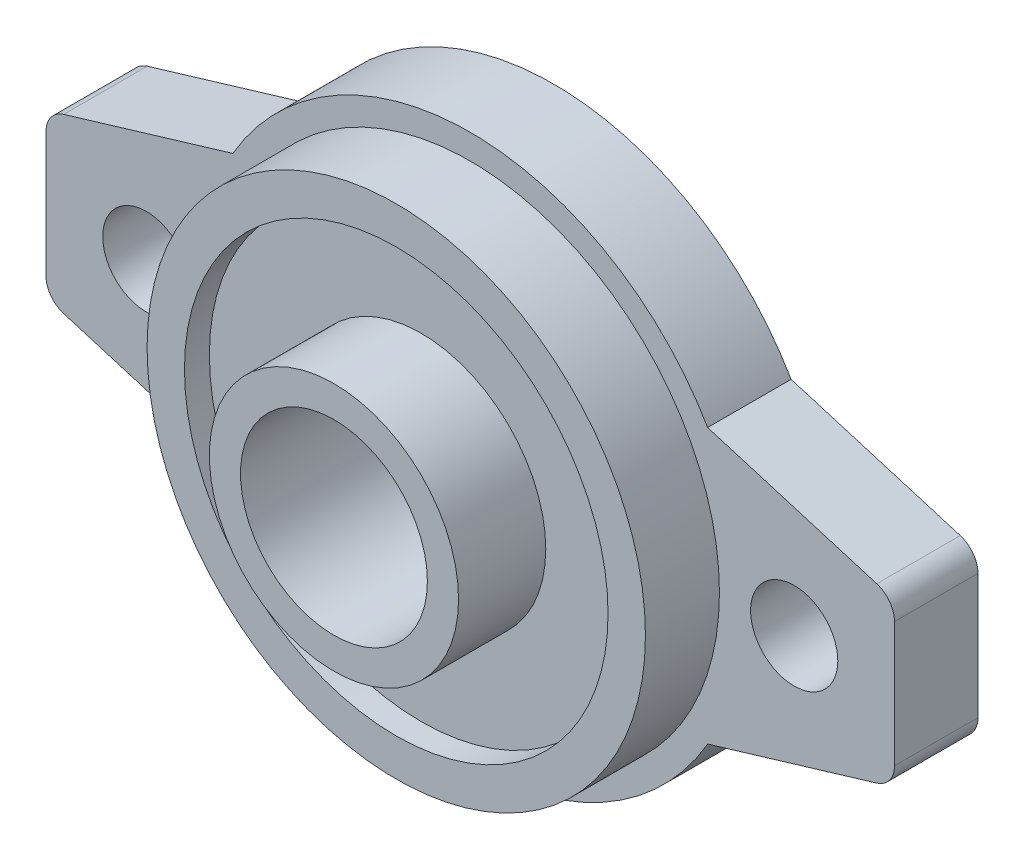
ISO-10303-21;
HEADER;
FILE_DESCRIPTION(('STEP AP214'),'2;1');
FILE_NAME('part.step','',(''),(''),'','','');
FILE_SCHEMA(('AUTOMOTIVE_DESIGN { 1 0 10303 214 1 1 1 1 }'));
ENDSEC;
DATA;
#1=APPLICATION_CONTEXT('core data for automotive mechanical design processes');
#2=APPLICATION_PROTOCOL_DEFINITION('international standard','automotive_design',2000,#1);
#3=PRODUCT_CONTEXT('',#1,'mechanical');
#4=PRODUCT('Part','Part','',(#3));
#5=PRODUCT_RELATED_PRODUCT_CATEGORY('part','',(#4));
#6=PRODUCT_DEFINITION_FORMATION('','',#4);
#7=PRODUCT_DEFINITION_CONTEXT('part definition',#1,'design');
#8=PRODUCT_DEFINITION('design','',#6,#7);
#9=PRODUCT_DEFINITION_SHAPE('','',#8);
#10=(LENGTH_UNIT() NAMED_UNIT(*) SI_UNIT(.MILLI.,.METRE.));
#11=(NAMED_UNIT(*) PLANE_ANGLE_UNIT() SI_UNIT($,.RADIAN.));
#12=(NAMED_UNIT(*) SI_UNIT($,.STERADIAN.) SOLID_ANGLE_UNIT());
#13=UNCERTAINTY_MEASURE_WITH_UNIT(LENGTH_MEASURE(1.E-05),#10,'distance_accuracy_value','');
#14=(GEOMETRIC_REPRESENTATION_CONTEXT(3) GLOBAL_UNCERTAINTY_ASSIGNED_CONTEXT((#13)) GLOBAL_UNIT_ASSIGNED_CONTEXT((#10,
#11,#12)) REPRESENTATION_CONTEXT('',''));
#15=CARTESIAN_POINT('',(0.,0.,0.));
#16=DIRECTION('',(0.,0.,1.));
#17=DIRECTION('',(1.,0.,0.));
#18=AXIS2_PLACEMENT_3D('',#15,#16,#17);
#19=CARTESIAN_POINT('',(0.,0.,6.7));
#20=DIRECTION('',(0.,0.,-1.));
#21=DIRECTION('',(-1.,0.,0.));
#22=AXIS2_PLACEMENT_3D('',#19,#20,#21);
#23=CYLINDRICAL_SURFACE('',#22,22.);
#24=CARTESIAN_POINT('',(0.,0.,0.));
#25=DIRECTION('',(0.,0.,1.));
#26=DIRECTION('',(1.,0.,0.));
#27=AXIS2_PLACEMENT_3D('',#24,#25,#26);
#28=CIRCLE('',#27,22.);
#29=CARTESIAN_POINT('',(-19.0525588832576,-11.,0.));
#30=VERTEX_POINT('',#29);
#31=CARTESIAN_POINT('',(19.0525588832577,-11.,0.));
#32=VERTEX_POINT('',#31);
#33=EDGE_CURVE('E313',#30,#32,#28,.T.);
#34=ORIENTED_EDGE('',*,*,#33,.T.);
#35=DIRECTION('',(0.,0.,-1.));
#36=VECTOR('',#35,1.);
#37=CARTESIAN_POINT('',(19.0525588832577,-11.,6.7));
#38=LINE('',#37,#36);
#39=CARTESIAN_POINT('',(19.0525588832577,-11.,6.7));
#40=VERTEX_POINT('',#39);
#41=EDGE_CURVE('E217',#40,#32,#38,.T.);
#42=ORIENTED_EDGE('',*,*,#41,.F.);
#43=CARTESIAN_POINT('',(0.,0.,6.7));
#44=DIRECTION('',(0.,0.,1.));
#45=DIRECTION('',(1.,0.,0.));
#46=AXIS2_PLACEMENT_3D('',#43,#44,#45);
#47=CIRCLE('',#46,22.);
#48=CARTESIAN_POINT('',(-19.0525588832576,-11.,6.7));
#49=VERTEX_POINT('',#48);
#50=EDGE_CURVE('E201',#49,#40,#47,.T.);
#51=ORIENTED_EDGE('',*,*,#50,.F.);
#52=DIRECTION('',(0.,0.,-1.));
#53=VECTOR('',#52,1.);
#54=CARTESIAN_POINT('',(-19.0525588832576,-11.,6.7));
#55=LINE('',#54,#53);
#56=EDGE_CURVE('E215',#49,#30,#55,.T.);
#57=ORIENTED_EDGE('',*,*,#56,.T.);
#58=EDGE_LOOP('',(#34,#42,#51,#57));
#59=FACE_BOUND('',#58,.T.);
#60=ADVANCED_FACE('F103',(#59),#23,.T.);
#61=CARTESIAN_POINT('',(4.60066999953504,-15.3355666651168,6.7));
#62=DIRECTION('',(0.287347885566346,-0.957826285221151,0.));
#63=DIRECTION('',(0.957826285221151,0.287347885566346,0.));
#64=AXIS2_PLACEMENT_3D('',#61,#62,#63);
#65=PLANE('',#64);
#66=DIRECTION('',(-0.957826285221151,-0.287347885566345,0.));
#67=VECTOR('',#66,1.);
#68=CARTESIAN_POINT('',(4.60066999953504,-15.3355666651168,0.));
#69=LINE('',#68,#67);
#70=CARTESIAN_POINT('',(32.6272546543903,-6.9275912686602,0.));
#71=VERTEX_POINT('',#70);
#72=EDGE_CURVE('E287',#71,#32,#69,.T.);
#73=ORIENTED_EDGE('',*,*,#72,.F.);
#74=DIRECTION('',(0.,0.,-1.));
#75=VECTOR('',#74,1.);
#76=CARTESIAN_POINT('',(32.6272546543903,-6.9275912686602,6.7));
#77=LINE('',#76,#75);
#78=CARTESIAN_POINT('',(32.6272546543903,-6.9275912686602,6.7));
#79=VERTEX_POINT('',#78);
#80=EDGE_CURVE('E112',#71,#79,#77,.F.);
#81=ORIENTED_EDGE('',*,*,#80,.T.);
#82=DIRECTION('',(-0.957826285221151,-0.287347885566345,0.));
#83=VECTOR('',#82,1.);
#84=CARTESIAN_POINT('',(4.60066999953504,-15.3355666651168,6.7));
#85=LINE('',#84,#83);
#86=EDGE_CURVE('E219',#79,#40,#85,.T.);
#87=ORIENTED_EDGE('',*,*,#86,.T.);
#88=ORIENTED_EDGE('',*,*,#41,.T.);
#89=EDGE_LOOP('',(#73,#81,#87,#88));
#90=FACE_BOUND('',#89,.T.);
#91=ADVANCED_FACE('F286',(#90),#65,.T.);
#92=CARTESIAN_POINT('',(34.0525588832577,0.,6.7));
#93=DIRECTION('',(1.,0.,0.));
#94=DIRECTION('',(0.,0.,-1.));
#95=AXIS2_PLACEMENT_3D('',#92,#93,#94);
#96=PLANE('',#95);
#97=DIRECTION('',(0.,-1.,0.));
#98=VECTOR('',#97,1.);
#99=CARTESIAN_POINT('',(34.0525588832577,0.,6.7));
#100=LINE('',#99,#98);
#101=CARTESIAN_POINT('',(34.0525588832577,5.01193869821789,6.7));
#102=VERTEX_POINT('',#101);
#103=CARTESIAN_POINT('',(34.0525588832577,-5.01193869821789,6.7));
#104=VERTEX_POINT('',#103);
#105=EDGE_CURVE('E292',#102,#104,#100,.T.);
#106=ORIENTED_EDGE('',*,*,#105,.T.);
#107=DIRECTION('',(0.,0.,-1.));
#108=VECTOR('',#107,1.);
#109=CARTESIAN_POINT('',(34.0525588832577,-5.01193869821789,6.7));
#110=LINE('',#109,#108);
#111=CARTESIAN_POINT('',(34.0525588832577,-5.01193869821789,0.));
#112=VERTEX_POINT('',#111);
#113=EDGE_CURVE('E279',#104,#112,#110,.T.);
#114=ORIENTED_EDGE('',*,*,#113,.T.);
#115=DIRECTION('',(0.,-1.,0.));
#116=VECTOR('',#115,1.);
#117=CARTESIAN_POINT('',(34.0525588832577,0.,0.));
#118=LINE('',#117,#116);
#119=CARTESIAN_POINT('',(34.0525588832577,5.01193869821789,0.));
#120=VERTEX_POINT('',#119);
#121=EDGE_CURVE('E300',#120,#112,#118,.T.);
#122=ORIENTED_EDGE('',*,*,#121,.F.);
#123=DIRECTION('',(0.,0.,-1.));
#124=VECTOR('',#123,1.);
#125=CARTESIAN_POINT('',(34.0525588832577,5.01193869821789,6.7));
#126=LINE('',#125,#124);
#127=EDGE_CURVE('E276',#120,#102,#126,.F.);
#128=ORIENTED_EDGE('',*,*,#127,.T.);
#129=EDGE_LOOP('',(#106,#114,#122,#128));
#130=FACE_BOUND('',#129,.T.);
#131=ADVANCED_FACE('F299',(#130),#96,.T.);
#132=CARTESIAN_POINT('',(4.60066999953503,15.3355666651168,6.7));
#133=DIRECTION('',(0.287347885566345,0.957826285221151,0.));
#134=DIRECTION('',(-0.957826285221151,0.287347885566345,0.));
#135=AXIS2_PLACEMENT_3D('',#132,#133,#134);
#136=PLANE('',#135);
#137=DIRECTION('',(0.957826285221151,-0.287347885566345,0.));
#138=VECTOR('',#137,1.);
#139=CARTESIAN_POINT('',(4.60066999953503,15.3355666651168,6.7));
#140=LINE('',#139,#138);
#141=CARTESIAN_POINT('',(19.0525588832577,11.,6.7));
#142=VERTEX_POINT('',#141);
#143=CARTESIAN_POINT('',(32.6272546543904,6.92759126866019,6.7));
#144=VERTEX_POINT('',#143);
#145=EDGE_CURVE('E343',#142,#144,#140,.T.);
#146=ORIENTED_EDGE('',*,*,#145,.T.);
#147=DIRECTION('',(0.,0.,-1.));
#148=VECTOR('',#147,1.);
#149=CARTESIAN_POINT('',(32.6272546543904,6.92759126866019,6.7));
#150=LINE('',#149,#148);
#151=CARTESIAN_POINT('',(32.6272546543904,6.92759126866019,0.));
#152=VERTEX_POINT('',#151);
#153=EDGE_CURVE('E13',#144,#152,#150,.T.);
#154=ORIENTED_EDGE('',*,*,#153,.T.);
#155=DIRECTION('',(0.957826285221151,-0.287347885566345,0.));
#156=VECTOR('',#155,1.);
#157=CARTESIAN_POINT('',(4.60066999953503,15.3355666651168,0.));
#158=LINE('',#157,#156);
#159=CARTESIAN_POINT('',(19.0525588832577,11.,0.));
#160=VERTEX_POINT('',#159);
#161=EDGE_CURVE('E307',#160,#152,#158,.T.);
#162=ORIENTED_EDGE('',*,*,#161,.F.);
#163=DIRECTION('',(0.,0.,-1.));
#164=VECTOR('',#163,1.);
#165=CARTESIAN_POINT('',(19.0525588832577,11.,6.7));
#166=LINE('',#165,#164);
#167=EDGE_CURVE('E233',#142,#160,#166,.T.);
#168=ORIENTED_EDGE('',*,*,#167,.F.);
#169=EDGE_LOOP('',(#146,#154,#162,#168));
#170=FACE_BOUND('',#169,.T.);
#171=ADVANCED_FACE('F341',(#170),#136,.T.);
#172=CARTESIAN_POINT('',(0.,0.,6.7));
#173=DIRECTION('',(0.,0.,-1.));
#174=DIRECTION('',(-1.,0.,0.));
#175=AXIS2_PLACEMENT_3D('',#172,#173,#174);
#176=CYLINDRICAL_SURFACE('',#175,22.);
#177=CARTESIAN_POINT('',(0.,0.,0.));
#178=DIRECTION('',(0.,0.,1.));
#179=DIRECTION('',(1.,0.,0.));
#180=AXIS2_PLACEMENT_3D('',#177,#178,#179);
#181=CIRCLE('',#180,22.);
#182=CARTESIAN_POINT('',(-19.0525588832577,11.,0.));
#183=VERTEX_POINT('',#182);
#184=EDGE_CURVE('E311',#160,#183,#181,.T.);
#185=ORIENTED_EDGE('',*,*,#184,.T.);
#186=DIRECTION('',(0.,0.,-1.));
#187=VECTOR('',#186,1.);
#188=CARTESIAN_POINT('',(-19.0525588832577,11.,6.7));
#189=LINE('',#188,#187);
#190=CARTESIAN_POINT('',(-19.0525588832577,11.,6.7));
#191=VERTEX_POINT('',#190);
#192=EDGE_CURVE('E327',#191,#183,#189,.T.);
#193=ORIENTED_EDGE('',*,*,#192,.F.);
#194=CARTESIAN_POINT('',(0.,0.,6.7));
#195=DIRECTION('',(0.,0.,1.));
#196=DIRECTION('',(1.,0.,0.));
#197=AXIS2_PLACEMENT_3D('',#194,#195,#196);
#198=CIRCLE('',#197,22.);
#199=EDGE_CURVE('E337',#142,#191,#198,.T.);
#200=ORIENTED_EDGE('',*,*,#199,.F.);
#201=ORIENTED_EDGE('',*,*,#167,.T.);
#202=EDGE_LOOP('',(#185,#193,#200,#201));
#203=FACE_BOUND('',#202,.T.);
#204=ADVANCED_FACE('F335',(#203),#176,.T.);
#205=CARTESIAN_POINT('',(-4.60066999953503,15.3355666651168,6.7));
#206=DIRECTION('',(0.287347885566345,-0.957826285221151,0.));
#207=DIRECTION('',(0.957826285221151,0.287347885566345,0.));
#208=AXIS2_PLACEMENT_3D('',#205,#206,#207);
#209=PLANE('',#208);
#210=DIRECTION('',(-0.957826285221151,-0.287347885566345,0.));
#211=VECTOR('',#210,1.);
#212=CARTESIAN_POINT('',(-4.60066999953503,15.3355666651168,0.));
#213=LINE('',#212,#211);
#214=CARTESIAN_POINT('',(-32.6272546543904,6.92759126866018,0.));
#215=VERTEX_POINT('',#214);
#216=EDGE_CURVE('E319',#183,#215,#213,.T.);
#217=ORIENTED_EDGE('',*,*,#216,.T.);
#218=DIRECTION('',(0.,0.,-1.));
#219=VECTOR('',#218,1.);
#220=CARTESIAN_POINT('',(-32.6272546543904,6.92759126866018,6.7));
#221=LINE('',#220,#219);
#222=CARTESIAN_POINT('',(-32.6272546543904,6.92759126866018,6.7));
#223=VERTEX_POINT('',#222);
#224=EDGE_CURVE('E119',#215,#223,#221,.F.);
#225=ORIENTED_EDGE('',*,*,#224,.T.);
#226=DIRECTION('',(-0.957826285221151,-0.287347885566345,0.));
#227=VECTOR('',#226,1.);
#228=CARTESIAN_POINT('',(-4.60066999953503,15.3355666651168,6.7));
#229=LINE('',#228,#227);
#230=EDGE_CURVE('E352',#191,#223,#229,.T.);
#231=ORIENTED_EDGE('',*,*,#230,.F.);
#232=ORIENTED_EDGE('',*,*,#192,.T.);
#233=EDGE_LOOP('',(#217,#225,#231,#232));
#234=FACE_BOUND('',#233,.T.);
#235=ADVANCED_FACE('F482',(#234),#209,.F.);
#236=CARTESIAN_POINT('',(-34.0525588832577,0.,6.7));
#237=DIRECTION('',(1.,0.,0.));
#238=DIRECTION('',(0.,0.,-1.));
#239=AXIS2_PLACEMENT_3D('',#236,#237,#238);
#240=PLANE('',#239);
#241=DIRECTION('',(0.,-1.,0.));
#242=VECTOR('',#241,1.);
#243=CARTESIAN_POINT('',(-34.0525588832577,0.,0.));
#244=LINE('',#243,#242);
#245=CARTESIAN_POINT('',(-34.0525588832577,5.01193869821788,0.));
#246=VERTEX_POINT('',#245);
#247=CARTESIAN_POINT('',(-34.0525588832577,-5.0119386982179,0.));
#248=VERTEX_POINT('',#247);
#249=EDGE_CURVE('E322',#246,#248,#244,.T.);
#250=ORIENTED_EDGE('',*,*,#249,.T.);
#251=DIRECTION('',(0.,0.,-1.));
#252=VECTOR('',#251,1.);
#253=CARTESIAN_POINT('',(-34.0525588832577,-5.0119386982179,6.7));
#254=LINE('',#253,#252);
#255=CARTESIAN_POINT('',(-34.0525588832577,-5.0119386982179,6.7));
#256=VERTEX_POINT('',#255);
#257=EDGE_CURVE('E261',#248,#256,#254,.F.);
#258=ORIENTED_EDGE('',*,*,#257,.T.);
#259=DIRECTION('',(0.,-1.,0.));
#260=VECTOR('',#259,1.);
#261=CARTESIAN_POINT('',(-34.0525588832577,0.,6.7));
#262=LINE('',#261,#260);
#263=CARTESIAN_POINT('',(-34.0525588832577,5.01193869821788,6.7));
#264=VERTEX_POINT('',#263);
#265=EDGE_CURVE('E330',#264,#256,#262,.T.);
#266=ORIENTED_EDGE('',*,*,#265,.F.);
#267=DIRECTION('',(0.,0.,-1.));
#268=VECTOR('',#267,1.);
#269=CARTESIAN_POINT('',(-34.0525588832577,5.01193869821788,6.7));
#270=LINE('',#269,#268);
#271=EDGE_CURVE('E257',#264,#246,#270,.T.);
#272=ORIENTED_EDGE('',*,*,#271,.T.);
#273=EDGE_LOOP('',(#250,#258,#266,#272));
#274=FACE_BOUND('',#273,.T.);
#275=ADVANCED_FACE('F370',(#274),#240,.F.);
#276=CARTESIAN_POINT('',(-4.60066999953503,-15.3355666651168,6.7));
#277=DIRECTION('',(0.287347885566345,0.957826285221151,0.));
#278=DIRECTION('',(-0.957826285221152,0.287347885566345,0.));
#279=AXIS2_PLACEMENT_3D('',#276,#277,#278);
#280=PLANE('',#279);
#281=DIRECTION('',(0.957826285221152,-0.287347885566345,0.));
#282=VECTOR('',#281,1.);
#283=CARTESIAN_POINT('',(-4.60066999953503,-15.3355666651168,6.7));
#284=LINE('',#283,#282);
#285=CARTESIAN_POINT('',(-32.6272546543904,-6.9275912686602,6.7));
#286=VERTEX_POINT('',#285);
#287=EDGE_CURVE('E196',#286,#49,#284,.T.);
#288=ORIENTED_EDGE('',*,*,#287,.F.);
#289=DIRECTION('',(0.,0.,-1.));
#290=VECTOR('',#289,1.);
#291=CARTESIAN_POINT('',(-32.6272546543903,-6.9275912686602,6.7));
#292=LINE('',#291,#290);
#293=CARTESIAN_POINT('',(-32.6272546543904,-6.9275912686602,0.));
#294=VERTEX_POINT('',#293);
#295=EDGE_CURVE('E231',#286,#294,#292,.T.);
#296=ORIENTED_EDGE('',*,*,#295,.T.);
#297=DIRECTION('',(0.957826285221152,-0.287347885566345,0.));
#298=VECTOR('',#297,1.);
#299=CARTESIAN_POINT('',(-4.60066999953503,-15.3355666651168,0.));
#300=LINE('',#299,#298);
#301=EDGE_CURVE('E223',#294,#30,#300,.T.);
#302=ORIENTED_EDGE('',*,*,#301,.T.);
#303=ORIENTED_EDGE('',*,*,#56,.F.);
#304=EDGE_LOOP('',(#288,#296,#302,#303));
#305=FACE_BOUND('',#304,.T.);
#306=ADVANCED_FACE('F221',(#305),#280,.F.);
#307=CARTESIAN_POINT('',(26.,0.,6.7));
#308=DIRECTION('',(0.,0.,-1.));
#309=DIRECTION('',(-1.,0.,0.));
#310=AXIS2_PLACEMENT_3D('',#307,#308,#309);
#311=CYLINDRICAL_SURFACE('',#310,3.5);
#312=CARTESIAN_POINT('',(26.,0.,6.7));
#313=DIRECTION('',(0.,0.,1.));
#314=DIRECTION('',(1.,0.,0.));
#315=AXIS2_PLACEMENT_3D('',#312,#313,#314);
#316=CIRCLE('',#315,3.5);
#317=CARTESIAN_POINT('',(29.5,0.,6.7));
#318=VERTEX_POINT('',#317);
#319=EDGE_CURVE('E210',#318,#318,#316,.T.);
#320=ORIENTED_EDGE('',*,*,#319,.T.);
#321=EDGE_LOOP('',(#320));
#322=FACE_BOUND('',#321,.T.);
#323=CARTESIAN_POINT('',(26.,0.,0.));
#324=DIRECTION('',(0.,0.,1.));
#325=DIRECTION('',(1.,0.,0.));
#326=AXIS2_PLACEMENT_3D('',#323,#324,#325);
#327=CIRCLE('',#326,3.5);
#328=CARTESIAN_POINT('',(29.5,0.,0.));
#329=VERTEX_POINT('',#328);
#330=EDGE_CURVE('E360',#329,#329,#327,.T.);
#331=ORIENTED_EDGE('',*,*,#330,.F.);
#332=EDGE_LOOP('',(#331));
#333=FACE_BOUND('',#332,.T.);
#334=ADVANCED_FACE('F398',(#322,#333),#311,.F.);
#335=CARTESIAN_POINT('',(-26.,0.,6.7));
#336=DIRECTION('',(0.,0.,-1.));
#337=DIRECTION('',(-1.,0.,0.));
#338=AXIS2_PLACEMENT_3D('',#335,#336,#337);
#339=CYLINDRICAL_SURFACE('',#338,3.5);
#340=CARTESIAN_POINT('',(-26.,0.,6.7));
#341=DIRECTION('',(0.,0.,1.));
#342=DIRECTION('',(1.,0.,0.));
#343=AXIS2_PLACEMENT_3D('',#340,#341,#342);
#344=CIRCLE('',#343,3.5);
#345=CARTESIAN_POINT('',(-22.5,0.,6.7));
#346=VERTEX_POINT('',#345);
#347=EDGE_CURVE('E326',#346,#346,#344,.F.);
#348=ORIENTED_EDGE('',*,*,#347,.F.);
#349=EDGE_LOOP('',(#348));
#350=FACE_BOUND('',#349,.T.);
#351=CARTESIAN_POINT('',(-26.,0.,0.));
#352=DIRECTION('',(0.,0.,1.));
#353=DIRECTION('',(1.,0.,0.));
#354=AXIS2_PLACEMENT_3D('',#351,#352,#353);
#355=CIRCLE('',#354,3.5);
#356=CARTESIAN_POINT('',(-22.5,0.,0.));
#357=VERTEX_POINT('',#356);
#358=EDGE_CURVE('E240',#357,#357,#355,.F.);
#359=ORIENTED_EDGE('',*,*,#358,.T.);
#360=EDGE_LOOP('',(#359));
#361=FACE_BOUND('',#360,.T.);
#362=ADVANCED_FACE('F400',(#350,#361),#339,.F.);
#363=CARTESIAN_POINT('',(0.,0.,0.));
#364=DIRECTION('',(0.,0.,1.));
#365=DIRECTION('',(1.,0.,0.));
#366=AXIS2_PLACEMENT_3D('',#363,#364,#365);
#367=PLANE('',#366);
#368=ORIENTED_EDGE('',*,*,#358,.F.);
#369=EDGE_LOOP('',(#368));
#370=FACE_BOUND('',#369,.T.);
#371=ORIENTED_EDGE('',*,*,#330,.T.);
#372=EDGE_LOOP('',(#371));
#373=FACE_BOUND('',#372,.T.);
#374=ORIENTED_EDGE('',*,*,#301,.F.);
#375=CARTESIAN_POINT('',(-32.0525588832577,-5.0119386982179,0.));
#376=DIRECTION('',(0.,0.,1.));
#377=DIRECTION('',(1.,0.,0.));
#378=AXIS2_PLACEMENT_3D('',#375,#376,#377);
#379=CIRCLE('',#378,2.);
#380=EDGE_CURVE('E254',#294,#248,#379,.F.);
#381=ORIENTED_EDGE('',*,*,#380,.T.);
#382=ORIENTED_EDGE('',*,*,#249,.F.);
#383=CARTESIAN_POINT('',(-32.0525588832577,5.01193869821788,0.));
#384=DIRECTION('',(0.,0.,1.));
#385=DIRECTION('',(1.,0.,0.));
#386=AXIS2_PLACEMENT_3D('',#383,#384,#385);
#387=CIRCLE('',#386,2.);
#388=EDGE_CURVE('E251',#246,#215,#387,.F.);
#389=ORIENTED_EDGE('',*,*,#388,.T.);
#390=ORIENTED_EDGE('',*,*,#216,.F.);
#391=ORIENTED_EDGE('',*,*,#184,.F.);
#392=ORIENTED_EDGE('',*,*,#161,.T.);
#393=CARTESIAN_POINT('',(32.0525588832577,5.01193869821789,0.));
#394=DIRECTION('',(0.,0.,1.));
#395=DIRECTION('',(1.,0.,0.));
#396=AXIS2_PLACEMENT_3D('',#393,#394,#395);
#397=CIRCLE('',#396,2.);
#398=EDGE_CURVE('E245',#152,#120,#397,.F.);
#399=ORIENTED_EDGE('',*,*,#398,.T.);
#400=ORIENTED_EDGE('',*,*,#121,.T.);
#401=CARTESIAN_POINT('',(32.0525588832577,-5.01193869821789,0.));
#402=DIRECTION('',(0.,0.,1.));
#403=DIRECTION('',(1.,0.,0.));
#404=AXIS2_PLACEMENT_3D('',#401,#402,#403);
#405=CIRCLE('',#404,2.);
#406=EDGE_CURVE('E248',#112,#71,#405,.F.);
#407=ORIENTED_EDGE('',*,*,#406,.T.);
#408=ORIENTED_EDGE('',*,*,#72,.T.);
#409=ORIENTED_EDGE('',*,*,#33,.F.);
#410=EDGE_LOOP('',(#374,#381,#382,#389,#390,#391,#392,#399,#400,#407,#408,#409));
#411=FACE_BOUND('',#410,.T.);
#412=CARTESIAN_POINT('',(0.,0.,0.));
#413=DIRECTION('',(0.,0.,1.));
#414=DIRECTION('',(1.,0.,0.));
#415=AXIS2_PLACEMENT_3D('',#412,#413,#414);
#416=CIRCLE('',#415,7.5);
#417=CARTESIAN_POINT('',(7.5,0.,0.));
#418=VERTEX_POINT('',#417);
#419=EDGE_CURVE('E439',#418,#418,#416,.T.);
#420=ORIENTED_EDGE('',*,*,#419,.T.);
#421=EDGE_LOOP('',(#420));
#422=FACE_BOUND('',#421,.T.);
#423=ADVANCED_FACE('F303',(#370,#373,#411,#422),#367,.F.);
#424=CARTESIAN_POINT('',(0.,0.,6.7));
#425=DIRECTION('',(0.,0.,1.));
#426=DIRECTION('',(1.,0.,0.));
#427=AXIS2_PLACEMENT_3D('',#424,#425,#426);
#428=PLANE('',#427);
#429=CARTESIAN_POINT('',(0.,0.,6.7));
#430=DIRECTION('',(0.,0.,1.));
#431=DIRECTION('',(1.,0.,0.));
#432=AXIS2_PLACEMENT_3D('',#429,#430,#431);
#433=CIRCLE('',#432,20.);
#434=CARTESIAN_POINT('',(-20.,0.,6.7));
#435=VERTEX_POINT('',#434);
#436=EDGE_CURVE('E237',#435,#435,#433,.F.);
#437=ORIENTED_EDGE('',*,*,#436,.T.);
#438=EDGE_LOOP('',(#437));
#439=FACE_BOUND('',#438,.T.);
#440=ORIENTED_EDGE('',*,*,#347,.T.);
#441=EDGE_LOOP('',(#440));
#442=FACE_BOUND('',#441,.T.);
#443=ORIENTED_EDGE('',*,*,#319,.F.);
#444=EDGE_LOOP('',(#443));
#445=FACE_BOUND('',#444,.T.);
#446=ORIENTED_EDGE('',*,*,#265,.T.);
#447=CARTESIAN_POINT('',(-32.0525588832577,-5.0119386982179,6.7));
#448=DIRECTION('',(0.,0.,1.));
#449=DIRECTION('',(1.,0.,0.));
#450=AXIS2_PLACEMENT_3D('',#447,#448,#449);
#451=CIRCLE('',#450,2.);
#452=EDGE_CURVE('E204',#256,#286,#451,.T.);
#453=ORIENTED_EDGE('',*,*,#452,.T.);
#454=ORIENTED_EDGE('',*,*,#287,.T.);
#455=ORIENTED_EDGE('',*,*,#50,.T.);
#456=ORIENTED_EDGE('',*,*,#86,.F.);
#457=CARTESIAN_POINT('',(32.0525588832577,-5.01193869821789,6.7));
#458=DIRECTION('',(0.,0.,1.));
#459=DIRECTION('',(1.,0.,0.));
#460=AXIS2_PLACEMENT_3D('',#457,#458,#459);
#461=CIRCLE('',#460,2.);
#462=EDGE_CURVE('E266',#79,#104,#461,.T.);
#463=ORIENTED_EDGE('',*,*,#462,.T.);
#464=ORIENTED_EDGE('',*,*,#105,.F.);
#465=CARTESIAN_POINT('',(32.0525588832577,5.01193869821789,6.7));
#466=DIRECTION('',(0.,0.,1.));
#467=DIRECTION('',(1.,0.,0.));
#468=AXIS2_PLACEMENT_3D('',#465,#466,#467);
#469=CIRCLE('',#468,2.);
#470=EDGE_CURVE('E127',#102,#144,#469,.T.);
#471=ORIENTED_EDGE('',*,*,#470,.T.);
#472=ORIENTED_EDGE('',*,*,#145,.F.);
#473=ORIENTED_EDGE('',*,*,#199,.T.);
#474=ORIENTED_EDGE('',*,*,#230,.T.);
#475=CARTESIAN_POINT('',(-32.0525588832577,5.01193869821788,6.7));
#476=DIRECTION('',(0.,0.,1.));
#477=DIRECTION('',(1.,0.,0.));
#478=AXIS2_PLACEMENT_3D('',#475,#476,#477);
#479=CIRCLE('',#478,2.);
#480=EDGE_CURVE('E269',#223,#264,#479,.T.);
#481=ORIENTED_EDGE('',*,*,#480,.T.);
#482=EDGE_LOOP('',(#446,#453,#454,#455,#456,#463,#464,#471,#472,#473,#474,#481));
#483=FACE_BOUND('',#482,.T.);
#484=ADVANCED_FACE('F199',(#439,#442,#445,#483),#428,.T.);
#485=CARTESIAN_POINT('',(0.,0.,12.64));
#486=DIRECTION('',(0.,0.,-1.));
#487=DIRECTION('',(-1.,0.,0.));
#488=AXIS2_PLACEMENT_3D('',#485,#486,#487);
#489=CYLINDRICAL_SURFACE('',#488,17.);
#490=CARTESIAN_POINT('',(0.,0.,10.64));
#491=DIRECTION('',(0.,0.,1.));
#492=DIRECTION('',(1.,0.,0.));
#493=AXIS2_PLACEMENT_3D('',#490,#491,#492);
#494=CIRCLE('',#493,17.);
#495=CARTESIAN_POINT('',(-17.,0.,10.64));
#496=VERTEX_POINT('',#495);
#497=EDGE_CURVE('E226',#496,#496,#494,.T.);
#498=CARTESIAN_POINT('',(0.,0.,12.64));
#499=DIRECTION('',(0.,0.,1.));
#500=DIRECTION('',(1.,0.,0.));
#501=AXIS2_PLACEMENT_3D('',#498,#499,#500);
#502=CIRCLE('',#501,17.);
#503=CARTESIAN_POINT('',(-17.,0.,12.64));
#504=VERTEX_POINT('',#503);
#505=EDGE_CURVE('E426',#504,#504,#502,.T.);
#506=CARTESIAN_POINT('',(-17.,0.,10.64));
#507=CARTESIAN_POINT('',(-17.,0.,10.6608333333333));
#508=CARTESIAN_POINT('',(-17.,0.,10.6816666666667));
#509=CARTESIAN_POINT('',(-17.,0.,10.7233333333333));
#510=CARTESIAN_POINT('',(-17.,0.,10.7441666666667));
#511=CARTESIAN_POINT('',(-17.,0.,10.7858333333333));
#512=CARTESIAN_POINT('',(-17.,0.,10.8066666666667));
#513=CARTESIAN_POINT('',(-17.,0.,10.8483333333333));
#514=CARTESIAN_POINT('',(-17.,0.,10.8691666666667));
#515=CARTESIAN_POINT('',(-17.,0.,10.9108333333333));
#516=CARTESIAN_POINT('',(-17.,0.,10.9316666666667));
#517=CARTESIAN_POINT('',(-17.,0.,10.9733333333333));
#518=CARTESIAN_POINT('',(-17.,0.,10.9941666666667));
#519=CARTESIAN_POINT('',(-17.,0.,11.0358333333333));
#520=CARTESIAN_POINT('',(-17.,0.,11.0566666666667));
#521=CARTESIAN_POINT('',(-17.,0.,11.0983333333333));
#522=CARTESIAN_POINT('',(-17.,0.,11.1191666666667));
#523=CARTESIAN_POINT('',(-17.,0.,11.1608333333333));
#524=CARTESIAN_POINT('',(-17.,0.,11.1816666666667));
#525=CARTESIAN_POINT('',(-17.,0.,11.2233333333333));
#526=CARTESIAN_POINT('',(-17.,0.,11.2441666666667));
#527=CARTESIAN_POINT('',(-17.,0.,11.2858333333333));
#528=CARTESIAN_POINT('',(-17.,0.,11.3066666666667));
#529=CARTESIAN_POINT('',(-17.,0.,11.3483333333333));
#530=CARTESIAN_POINT('',(-17.,0.,11.3691666666667));
#531=CARTESIAN_POINT('',(-17.,0.,11.4108333333333));
#532=CARTESIAN_POINT('',(-17.,0.,11.4316666666667));
#533=CARTESIAN_POINT('',(-17.,0.,11.4733333333333));
#534=CARTESIAN_POINT('',(-17.,0.,11.4941666666667));
#535=CARTESIAN_POINT('',(-17.,0.,11.5358333333333));
#536=CARTESIAN_POINT('',(-17.,0.,11.5566666666667));
#537=CARTESIAN_POINT('',(-17.,0.,11.5983333333333));
#538=CARTESIAN_POINT('',(-17.,0.,11.6191666666667));
#539=CARTESIAN_POINT('',(-17.,0.,11.6608333333333));
#540=CARTESIAN_POINT('',(-17.,0.,11.6816666666667));
#541=CARTESIAN_POINT('',(-17.,0.,11.7233333333333));
#542=CARTESIAN_POINT('',(-17.,0.,11.7441666666667));
#543=CARTESIAN_POINT('',(-17.,0.,11.7858333333333));
#544=CARTESIAN_POINT('',(-17.,0.,11.8066666666667));
#545=CARTESIAN_POINT('',(-17.,0.,11.8483333333333));
#546=CARTESIAN_POINT('',(-17.,0.,11.8691666666667));
#547=CARTESIAN_POINT('',(-17.,0.,11.9108333333333));
#548=CARTESIAN_POINT('',(-17.,0.,11.9316666666667));
#549=CARTESIAN_POINT('',(-17.,0.,11.9733333333333));
#550=CARTESIAN_POINT('',(-17.,0.,11.9941666666667));
#551=CARTESIAN_POINT('',(-17.,0.,12.0358333333333));
#552=CARTESIAN_POINT('',(-17.,0.,12.0566666666667));
#553=CARTESIAN_POINT('',(-17.,0.,12.0983333333333));
#554=CARTESIAN_POINT('',(-17.,0.,12.1191666666667));
#555=CARTESIAN_POINT('',(-17.,0.,12.1608333333333));
#556=CARTESIAN_POINT('',(-17.,0.,12.1816666666667));
#557=CARTESIAN_POINT('',(-17.,0.,12.2233333333333));
#558=CARTESIAN_POINT('',(-17.,0.,12.2441666666667));
#559=CARTESIAN_POINT('',(-17.,0.,12.2858333333333));
#560=CARTESIAN_POINT('',(-17.,0.,12.3066666666667));
#561=CARTESIAN_POINT('',(-17.,0.,12.3483333333333));
#562=CARTESIAN_POINT('',(-17.,0.,12.3691666666667));
#563=CARTESIAN_POINT('',(-17.,0.,12.4108333333333));
#564=CARTESIAN_POINT('',(-17.,0.,12.4316666666667));
#565=CARTESIAN_POINT('',(-17.,0.,12.4733333333333));
#566=CARTESIAN_POINT('',(-17.,0.,12.4941666666667));
#567=CARTESIAN_POINT('',(-17.,0.,12.5358333333333));
#568=CARTESIAN_POINT('',(-17.,0.,12.5566666666667));
#569=CARTESIAN_POINT('',(-17.,0.,12.5983333333333));
#570=CARTESIAN_POINT('',(-17.,0.,12.6191666666667));
#571=CARTESIAN_POINT('',(-17.,0.,12.64));
#572=B_SPLINE_CURVE_WITH_KNOTS('',3,(#506,#507,#508,#509,#510,#511,#512,#513,#514,#515,#516,
#517,#518,#519,#520,#521,#522,#523,#524,#525,#526,#527,#528,#529,#530,#531,#532,#533,#534,#535,
#536,#537,#538,#539,#540,#541,#542,#543,#544,#545,#546,#547,#548,#549,#550,#551,#552,#553,#554,
#555,#556,#557,#558,#559,#560,#561,#562,#563,#564,#565,#566,#567,#568,#569,#570,#571),
.UNSPECIFIED.,.F.,.F.,(4,2,2,2,2,2,2,2,2,2,2,2,2,2,2,2,2,2,2,2,2,2,2,2,2,2,2,2,2,2,2,2,4),(0.,
0.0625000000000001,0.125,0.1875,0.25,0.3125,0.375,0.4375,0.5,0.5625,0.625000000000001,
0.687500000000001,0.750000000000001,0.812500000000001,0.875000000000001,0.937500000000001,1.,
1.0625,1.125,1.1875,1.25,1.3125,1.375,1.4375,1.5,1.5625,1.625,1.6875,1.75,1.8125,1.875,1.9375,
2.),.UNSPECIFIED.);
#573=EDGE_CURVE('BSEAM472',#496,#504,#572,.T.);
#574=ORIENTED_EDGE('',*,*,#497,.F.);
#575=ORIENTED_EDGE('',*,*,#505,.T.);
#576=ORIENTED_EDGE('',*,*,#573,.T.);
#577=ORIENTED_EDGE('',*,*,#573,.F.);
#578=EDGE_LOOP('',(#574,#576,#575,#577));
#579=FACE_BOUND('',#578,.T.);
#580=ADVANCED_FACE('F472',(#579),#489,.F.);
#581=CARTESIAN_POINT('',(0.,0.,12.64));
#582=DIRECTION('',(0.,0.,-1.));
#583=DIRECTION('',(-1.,0.,0.));
#584=AXIS2_PLACEMENT_3D('',#581,#582,#583);
#585=CYLINDRICAL_SURFACE('',#584,20.);
#586=CARTESIAN_POINT('',(0.,0.,12.64));
#587=DIRECTION('',(0.,0.,1.));
#588=DIRECTION('',(1.,0.,0.));
#589=AXIS2_PLACEMENT_3D('',#586,#587,#588);
#590=CIRCLE('',#589,20.);
#591=CARTESIAN_POINT('',(-20.,0.,12.64));
#592=VERTEX_POINT('',#591);
#593=EDGE_CURVE('E241',#592,#592,#590,.T.);
#594=CARTESIAN_POINT('',(-20.,0.,6.7));
#595=CARTESIAN_POINT('',(-20.,0.,6.761875));
#596=CARTESIAN_POINT('',(-20.,0.,6.82375));
#597=CARTESIAN_POINT('',(-20.,0.,6.9475));
#598=CARTESIAN_POINT('',(-20.,0.,7.009375));
#599=CARTESIAN_POINT('',(-20.,0.,7.133125));
#600=CARTESIAN_POINT('',(-20.,0.,7.195));
#601=CARTESIAN_POINT('',(-20.,0.,7.31875));
#602=CARTESIAN_POINT('',(-20.,0.,7.380625));
#603=CARTESIAN_POINT('',(-20.,0.,7.504375));
#604=CARTESIAN_POINT('',(-20.,0.,7.56625));
#605=CARTESIAN_POINT('',(-20.,0.,7.69));
#606=CARTESIAN_POINT('',(-20.,0.,7.751875));
#607=CARTESIAN_POINT('',(-20.,0.,7.875625));
#608=CARTESIAN_POINT('',(-20.,0.,7.9375));
#609=CARTESIAN_POINT('',(-20.,0.,8.06125));
#610=CARTESIAN_POINT('',(-20.,0.,8.123125));
#611=CARTESIAN_POINT('',(-20.,0.,8.246875));
#612=CARTESIAN_POINT('',(-20.,0.,8.30875));
#613=CARTESIAN_POINT('',(-20.,0.,8.4325));
#614=CARTESIAN_POINT('',(-20.,0.,8.494375));
#615=CARTESIAN_POINT('',(-20.,0.,8.618125));
#616=CARTESIAN_POINT('',(-20.,0.,8.68));
#617=CARTESIAN_POINT('',(-20.,0.,8.80375));
#618=CARTESIAN_POINT('',(-20.,0.,8.865625));
#619=CARTESIAN_POINT('',(-20.,0.,8.989375));
#620=CARTESIAN_POINT('',(-20.,0.,9.05125));
#621=CARTESIAN_POINT('',(-20.,0.,9.175));
#622=CARTESIAN_POINT('',(-20.,0.,9.236875));
#623=CARTESIAN_POINT('',(-20.,0.,9.360625));
#624=CARTESIAN_POINT('',(-20.,0.,9.4225));
#625=CARTESIAN_POINT('',(-20.,0.,9.54625));
#626=CARTESIAN_POINT('',(-20.,0.,9.608125));
#627=CARTESIAN_POINT('',(-20.,0.,9.731875));
#628=CARTESIAN_POINT('',(-20.,0.,9.79375));
#629=CARTESIAN_POINT('',(-20.,0.,9.9175));
#630=CARTESIAN_POINT('',(-20.,0.,9.979375));
#631=CARTESIAN_POINT('',(-20.,0.,10.103125));
#632=CARTESIAN_POINT('',(-20.,0.,10.165));
#633=CARTESIAN_POINT('',(-20.,0.,10.28875));
#634=CARTESIAN_POINT('',(-20.,0.,10.350625));
#635=CARTESIAN_POINT('',(-20.,0.,10.474375));
#636=CARTESIAN_POINT('',(-20.,0.,10.53625));
#637=CARTESIAN_POINT('',(-20.,0.,10.66));
#638=CARTESIAN_POINT('',(-20.,0.,10.721875));
#639=CARTESIAN_POINT('',(-20.,0.,10.845625));
#640=CARTESIAN_POINT('',(-20.,0.,10.9075));
#641=CARTESIAN_POINT('',(-20.,0.,11.03125));
#642=CARTESIAN_POINT('',(-20.,0.,11.093125));
#643=CARTESIAN_POINT('',(-20.,0.,11.216875));
#644=CARTESIAN_POINT('',(-20.,0.,11.27875));
#645=CARTESIAN_POINT('',(-20.,0.,11.4025));
#646=CARTESIAN_POINT('',(-20.,0.,11.464375));
#647=CARTESIAN_POINT('',(-20.,0.,11.588125));
#648=CARTESIAN_POINT('',(-20.,0.,11.65));
#649=CARTESIAN_POINT('',(-20.,0.,11.77375));
#650=CARTESIAN_POINT('',(-20.,0.,11.835625));
#651=CARTESIAN_POINT('',(-20.,0.,11.959375));
#652=CARTESIAN_POINT('',(-20.,0.,12.02125));
#653=CARTESIAN_POINT('',(-20.,0.,12.145));
#654=CARTESIAN_POINT('',(-20.,0.,12.206875));
#655=CARTESIAN_POINT('',(-20.,0.,12.330625));
#656=CARTESIAN_POINT('',(-20.,0.,12.3925));
#657=CARTESIAN_POINT('',(-20.,0.,12.51625));
#658=CARTESIAN_POINT('',(-20.,0.,12.578125));
#659=CARTESIAN_POINT('',(-20.,0.,12.64));
#660=B_SPLINE_CURVE_WITH_KNOTS('',3,(#594,#595,#596,#597,#598,#599,#600,#601,#602,#603,#604,
#605,#606,#607,#608,#609,#610,#611,#612,#613,#614,#615,#616,#617,#618,#619,#620,#621,#622,#623,
#624,#625,#626,#627,#628,#629,#630,#631,#632,#633,#634,#635,#636,#637,#638,#639,#640,#641,#642,
#643,#644,#645,#646,#647,#648,#649,#650,#651,#652,#653,#654,#655,#656,#657,#658,#659),
.UNSPECIFIED.,.F.,.F.,(4,2,2,2,2,2,2,2,2,2,2,2,2,2,2,2,2,2,2,2,2,2,2,2,2,2,2,2,2,2,2,2,4),(0.,
0.185625,0.37125,0.556875,0.7425,0.928125,1.11375,1.299375,1.485,1.670625,1.85625,2.041875,
2.2275,2.413125,2.59875,2.784375,2.97,3.155625,3.34125,3.526875,3.7125,3.898125,4.08375,
4.269375,4.455,4.640625,4.82625,5.011875,5.1975,5.383125,5.56875,5.754375,5.94),.UNSPECIFIED.);
#661=EDGE_CURVE('BSEAM468',#435,#592,#660,.T.);
#662=ORIENTED_EDGE('',*,*,#436,.F.);
#663=ORIENTED_EDGE('',*,*,#593,.F.);
#664=ORIENTED_EDGE('',*,*,#661,.T.);
#665=ORIENTED_EDGE('',*,*,#661,.F.);
#666=EDGE_LOOP('',(#662,#664,#663,#665));
#667=FACE_BOUND('',#666,.T.);
#668=ADVANCED_FACE('F468',(#667),#585,.T.);
#669=CARTESIAN_POINT('',(0.,0.,12.64));
#670=DIRECTION('',(0.,0.,1.));
#671=DIRECTION('',(1.,0.,0.));
#672=AXIS2_PLACEMENT_3D('',#669,#670,#671);
#673=PLANE('',#672);
#674=ORIENTED_EDGE('',*,*,#505,.F.);
#675=EDGE_LOOP('',(#674));
#676=FACE_BOUND('',#675,.T.);
#677=ORIENTED_EDGE('',*,*,#593,.T.);
#678=EDGE_LOOP('',(#677));
#679=FACE_BOUND('',#678,.T.);
#680=ADVANCED_FACE('F464',(#676,#679),#673,.T.);
#681=CARTESIAN_POINT('',(0.,0.,10.64));
#682=DIRECTION('',(0.,0.,1.));
#683=DIRECTION('',(1.,0.,0.));
#684=AXIS2_PLACEMENT_3D('',#681,#682,#683);
#685=PLANE('',#684);
#686=CARTESIAN_POINT('',(0.,0.,10.64));
#687=DIRECTION('',(0.,0.,1.));
#688=DIRECTION('',(1.,0.,0.));
#689=AXIS2_PLACEMENT_3D('',#686,#687,#688);
#690=CIRCLE('',#689,10.);
#691=CARTESIAN_POINT('',(10.,0.,10.64));
#692=VERTEX_POINT('',#691);
#693=EDGE_CURVE('E430',#692,#692,#690,.T.);
#694=ORIENTED_EDGE('',*,*,#693,.F.);
#695=EDGE_LOOP('',(#694));
#696=FACE_BOUND('',#695,.T.);
#697=ORIENTED_EDGE('',*,*,#497,.T.);
#698=EDGE_LOOP('',(#697));
#699=FACE_BOUND('',#698,.T.);
#700=ADVANCED_FACE('F450',(#696,#699),#685,.T.);
#701=CARTESIAN_POINT('',(0.,0.,52.9242712474619));
#702=DIRECTION('',(0.,0.,-1.));
#703=DIRECTION('',(-1.,0.,0.));
#704=AXIS2_PLACEMENT_3D('',#701,#702,#703);
#705=CYLINDRICAL_SURFACE('',#704,7.5);
#706=ORIENTED_EDGE('',*,*,#419,.F.);
#707=EDGE_LOOP('',(#706));
#708=FACE_BOUND('',#707,.T.);
#709=CARTESIAN_POINT('',(0.,0.,17.64));
#710=DIRECTION('',(0.,0.,1.));
#711=DIRECTION('',(1.,0.,0.));
#712=AXIS2_PLACEMENT_3D('',#709,#710,#711);
#713=CIRCLE('',#712,7.5);
#714=CARTESIAN_POINT('',(7.5,0.,17.64));
#715=VERTEX_POINT('',#714);
#716=EDGE_CURVE('E435',#715,#715,#713,.T.);
#717=ORIENTED_EDGE('',*,*,#716,.T.);
#718=EDGE_LOOP('',(#717));
#719=FACE_BOUND('',#718,.T.);
#720=ADVANCED_FACE('F447',(#708,#719),#705,.F.);
#721=CARTESIAN_POINT('',(0.,0.,52.9242712474619));
#722=DIRECTION('',(0.,0.,-1.));
#723=DIRECTION('',(-1.,0.,0.));
#724=AXIS2_PLACEMENT_3D('',#721,#722,#723);
#725=CYLINDRICAL_SURFACE('',#724,10.);
#726=ORIENTED_EDGE('',*,*,#693,.T.);
#727=EDGE_LOOP('',(#726));
#728=FACE_BOUND('',#727,.T.);
#729=CARTESIAN_POINT('',(0.,0.,17.64));
#730=DIRECTION('',(0.,0.,1.));
#731=DIRECTION('',(1.,0.,0.));
#732=AXIS2_PLACEMENT_3D('',#729,#730,#731);
#733=CIRCLE('',#732,10.);
#734=CARTESIAN_POINT('',(10.,0.,17.64));
#735=VERTEX_POINT('',#734);
#736=EDGE_CURVE('E434',#735,#735,#733,.T.);
#737=ORIENTED_EDGE('',*,*,#736,.F.);
#738=EDGE_LOOP('',(#737));
#739=FACE_BOUND('',#738,.T.);
#740=ADVANCED_FACE('F384',(#728,#739),#725,.T.);
#741=CARTESIAN_POINT('',(0.,0.,17.64));
#742=DIRECTION('',(0.,0.,1.));
#743=DIRECTION('',(1.,0.,0.));
#744=AXIS2_PLACEMENT_3D('',#741,#742,#743);
#745=PLANE('',#744);
#746=ORIENTED_EDGE('',*,*,#716,.F.);
#747=EDGE_LOOP('',(#746));
#748=FACE_BOUND('',#747,.T.);
#749=ORIENTED_EDGE('',*,*,#736,.T.);
#750=EDGE_LOOP('',(#749));
#751=FACE_BOUND('',#750,.T.);
#752=ADVANCED_FACE('F376',(#748,#751),#745,.T.);
#753=CARTESIAN_POINT('',(-32.0525588832577,-5.0119386982179,6.7));
#754=DIRECTION('',(0.,0.,-1.));
#755=DIRECTION('',(-1.,0.,0.));
#756=AXIS2_PLACEMENT_3D('',#753,#754,#755);
#757=CYLINDRICAL_SURFACE('',#756,2.);
#758=ORIENTED_EDGE('',*,*,#452,.F.);
#759=ORIENTED_EDGE('',*,*,#257,.F.);
#760=ORIENTED_EDGE('',*,*,#380,.F.);
#761=ORIENTED_EDGE('',*,*,#295,.F.);
#762=EDGE_LOOP('',(#758,#759,#760,#761));
#763=FACE_BOUND('',#762,.T.);
#764=ADVANCED_FACE('F373',(#763),#757,.T.);
#765=CARTESIAN_POINT('',(-32.0525588832577,5.01193869821788,6.7));
#766=DIRECTION('',(0.,0.,-1.));
#767=DIRECTION('',(-1.,0.,0.));
#768=AXIS2_PLACEMENT_3D('',#765,#766,#767);
#769=CYLINDRICAL_SURFACE('',#768,2.);
#770=ORIENTED_EDGE('',*,*,#480,.F.);
#771=ORIENTED_EDGE('',*,*,#224,.F.);
#772=ORIENTED_EDGE('',*,*,#388,.F.);
#773=ORIENTED_EDGE('',*,*,#271,.F.);
#774=EDGE_LOOP('',(#770,#771,#772,#773));
#775=FACE_BOUND('',#774,.T.);
#776=ADVANCED_FACE('F375',(#775),#769,.T.);
#777=CARTESIAN_POINT('',(32.0525588832577,-5.01193869821789,6.7));
#778=DIRECTION('',(0.,0.,-1.));
#779=DIRECTION('',(-1.,0.,0.));
#780=AXIS2_PLACEMENT_3D('',#777,#778,#779);
#781=CYLINDRICAL_SURFACE('',#780,2.);
#782=ORIENTED_EDGE('',*,*,#462,.F.);
#783=ORIENTED_EDGE('',*,*,#80,.F.);
#784=ORIENTED_EDGE('',*,*,#406,.F.);
#785=ORIENTED_EDGE('',*,*,#113,.F.);
#786=EDGE_LOOP('',(#782,#783,#784,#785));
#787=FACE_BOUND('',#786,.T.);
#788=ADVANCED_FACE('F295',(#787),#781,.T.);
#789=CARTESIAN_POINT('',(32.0525588832577,5.01193869821789,6.7));
#790=DIRECTION('',(0.,0.,-1.));
#791=DIRECTION('',(-1.,0.,0.));
#792=AXIS2_PLACEMENT_3D('',#789,#790,#791);
#793=CYLINDRICAL_SURFACE('',#792,2.);
#794=ORIENTED_EDGE('',*,*,#470,.F.);
#795=ORIENTED_EDGE('',*,*,#127,.F.);
#796=ORIENTED_EDGE('',*,*,#398,.F.);
#797=ORIENTED_EDGE('',*,*,#153,.F.);
#798=EDGE_LOOP('',(#794,#795,#796,#797));
#799=FACE_BOUND('',#798,.T.);
#800=ADVANCED_FACE('F105',(#799),#793,.T.);
#801=CLOSED_SHELL('',(#60,#91,#131,#171,#204,#235,#275,#306,#334,#362,#423,#484,#580,#668,#680,
#700,#720,#740,#752,#764,#776,#788,#800));
#802=MANIFOLD_SOLID_BREP('B2',#801);
#803=ADVANCED_BREP_SHAPE_REPRESENTATION('',(#18,#802),#14);
#804=SHAPE_DEFINITION_REPRESENTATION(#9,#803);
ENDSEC;
END-ISO-10303-21;
